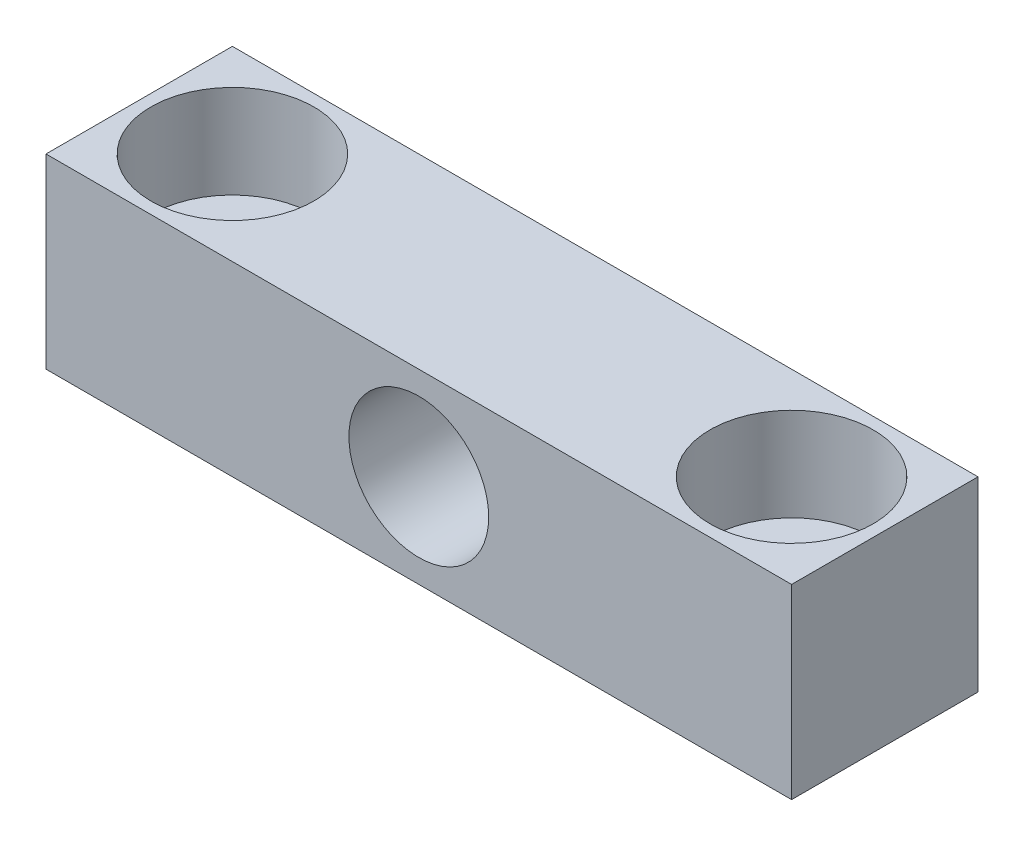
ISO-10303-21;
HEADER;
FILE_DESCRIPTION(('STEP AP214'),'2;1');
FILE_NAME('part.step','',(''),(''),'','','');
FILE_SCHEMA(('AUTOMOTIVE_DESIGN { 1 0 10303 214 1 1 1 1 }'));
ENDSEC;
DATA;
#1=APPLICATION_CONTEXT('core data for automotive mechanical design processes');
#2=APPLICATION_PROTOCOL_DEFINITION('international standard','automotive_design',2000,#1);
#3=PRODUCT_CONTEXT('',#1,'mechanical');
#4=PRODUCT('Part','Part','',(#3));
#5=PRODUCT_RELATED_PRODUCT_CATEGORY('part','',(#4));
#6=PRODUCT_DEFINITION_FORMATION('','',#4);
#7=PRODUCT_DEFINITION_CONTEXT('part definition',#1,'design');
#8=PRODUCT_DEFINITION('design','',#6,#7);
#9=PRODUCT_DEFINITION_SHAPE('','',#8);
#10=(LENGTH_UNIT() NAMED_UNIT(*) SI_UNIT(.MILLI.,.METRE.));
#11=(NAMED_UNIT(*) PLANE_ANGLE_UNIT() SI_UNIT($,.RADIAN.));
#12=(NAMED_UNIT(*) SI_UNIT($,.STERADIAN.) SOLID_ANGLE_UNIT());
#13=UNCERTAINTY_MEASURE_WITH_UNIT(LENGTH_MEASURE(1.E-05),#10,'distance_accuracy_value','');
#14=(GEOMETRIC_REPRESENTATION_CONTEXT(3) GLOBAL_UNCERTAINTY_ASSIGNED_CONTEXT((#13)) GLOBAL_UNIT_ASSIGNED_CONTEXT((#10,
#11,#12)) REPRESENTATION_CONTEXT('',''));
#15=CARTESIAN_POINT('',(0.,0.,0.));
#16=DIRECTION('',(0.,0.,1.));
#17=DIRECTION('',(1.,0.,0.));
#18=AXIS2_PLACEMENT_3D('',#15,#16,#17);
#19=CARTESIAN_POINT('',(-25.4,12.7,-6.35));
#20=DIRECTION('',(1.,0.,0.));
#21=DIRECTION('',(0.,0.,-1.));
#22=AXIS2_PLACEMENT_3D('',#19,#20,#21);
#23=PLANE('',#22);
#24=DIRECTION('',(0.,0.,1.));
#25=VECTOR('',#24,1.);
#26=CARTESIAN_POINT('',(-25.4,0.,-6.35));
#27=LINE('',#26,#25);
#28=CARTESIAN_POINT('',(-25.4,0.,-6.35));
#29=VERTEX_POINT('',#28);
#30=CARTESIAN_POINT('',(-25.4,0.,6.35));
#31=VERTEX_POINT('',#30);
#32=EDGE_CURVE('E95',#29,#31,#27,.T.);
#33=ORIENTED_EDGE('',*,*,#32,.T.);
#34=DIRECTION('',(0.,-1.,0.));
#35=VECTOR('',#34,1.);
#36=CARTESIAN_POINT('',(-25.4,12.7,6.35));
#37=LINE('',#36,#35);
#38=CARTESIAN_POINT('',(-25.4,12.7,6.35));
#39=VERTEX_POINT('',#38);
#40=EDGE_CURVE('E11',#39,#31,#37,.T.);
#41=ORIENTED_EDGE('',*,*,#40,.F.);
#42=DIRECTION('',(0.,0.,1.));
#43=VECTOR('',#42,1.);
#44=CARTESIAN_POINT('',(-25.4,12.7,-6.35));
#45=LINE('',#44,#43);
#46=CARTESIAN_POINT('',(-25.4,12.7,-6.35));
#47=VERTEX_POINT('',#46);
#48=EDGE_CURVE('E83',#47,#39,#45,.T.);
#49=ORIENTED_EDGE('',*,*,#48,.F.);
#50=DIRECTION('',(0.,-1.,0.));
#51=VECTOR('',#50,1.);
#52=CARTESIAN_POINT('',(-25.4,12.7,-6.35));
#53=LINE('',#52,#51);
#54=EDGE_CURVE('E91',#47,#29,#53,.T.);
#55=ORIENTED_EDGE('',*,*,#54,.T.);
#56=EDGE_LOOP('',(#33,#41,#49,#55));
#57=FACE_BOUND('',#56,.T.);
#58=ADVANCED_FACE('F32',(#57),#23,.F.);
#59=CARTESIAN_POINT('',(-25.4,12.7,6.35));
#60=DIRECTION('',(0.,0.,-1.));
#61=DIRECTION('',(-1.,0.,0.));
#62=AXIS2_PLACEMENT_3D('',#59,#60,#61);
#63=PLANE('',#62);
#64=CARTESIAN_POINT('',(0.,6.35,6.35));
#65=DIRECTION('',(0.,0.,1.));
#66=DIRECTION('',(1.,0.,0.));
#67=AXIS2_PLACEMENT_3D('',#64,#65,#66);
#68=CIRCLE('',#67,4.7625);
#69=CARTESIAN_POINT('',(4.7625,6.35,6.35));
#70=VERTEX_POINT('',#69);
#71=EDGE_CURVE('E109',#70,#70,#68,.T.);
#72=ORIENTED_EDGE('',*,*,#71,.F.);
#73=EDGE_LOOP('',(#72));
#74=FACE_BOUND('',#73,.T.);
#75=DIRECTION('',(1.,0.,0.));
#76=VECTOR('',#75,1.);
#77=CARTESIAN_POINT('',(-25.4,0.,6.35));
#78=LINE('',#77,#76);
#79=CARTESIAN_POINT('',(25.4,0.,6.35));
#80=VERTEX_POINT('',#79);
#81=EDGE_CURVE('E87',#31,#80,#78,.T.);
#82=ORIENTED_EDGE('',*,*,#81,.T.);
#83=DIRECTION('',(0.,-1.,0.));
#84=VECTOR('',#83,1.);
#85=CARTESIAN_POINT('',(25.4,12.7,6.35));
#86=LINE('',#85,#84);
#87=CARTESIAN_POINT('',(25.4,12.7,6.35));
#88=VERTEX_POINT('',#87);
#89=EDGE_CURVE('E40',#88,#80,#86,.T.);
#90=ORIENTED_EDGE('',*,*,#89,.F.);
#91=DIRECTION('',(1.,0.,0.));
#92=VECTOR('',#91,1.);
#93=CARTESIAN_POINT('',(-25.4,12.7,6.35));
#94=LINE('',#93,#92);
#95=EDGE_CURVE('E78',#39,#88,#94,.T.);
#96=ORIENTED_EDGE('',*,*,#95,.F.);
#97=ORIENTED_EDGE('',*,*,#40,.T.);
#98=EDGE_LOOP('',(#82,#90,#96,#97));
#99=FACE_BOUND('',#98,.T.);
#100=ADVANCED_FACE('F86',(#74,#99),#63,.F.);
#101=CARTESIAN_POINT('',(25.4,12.7,-6.35));
#102=DIRECTION('',(-1.,0.,0.));
#103=DIRECTION('',(0.,0.,1.));
#104=AXIS2_PLACEMENT_3D('',#101,#102,#103);
#105=PLANE('',#104);
#106=DIRECTION('',(0.,0.,-1.));
#107=VECTOR('',#106,1.);
#108=CARTESIAN_POINT('',(25.4,0.,-6.35));
#109=LINE('',#108,#107);
#110=CARTESIAN_POINT('',(25.4,0.,-6.35));
#111=VERTEX_POINT('',#110);
#112=EDGE_CURVE('E65',#80,#111,#109,.T.);
#113=ORIENTED_EDGE('',*,*,#112,.T.);
#114=DIRECTION('',(0.,-1.,0.));
#115=VECTOR('',#114,1.);
#116=CARTESIAN_POINT('',(25.4,12.7,-6.35));
#117=LINE('',#116,#115);
#118=CARTESIAN_POINT('',(25.4,12.7,-6.35));
#119=VERTEX_POINT('',#118);
#120=EDGE_CURVE('E88',#119,#111,#117,.T.);
#121=ORIENTED_EDGE('',*,*,#120,.F.);
#122=DIRECTION('',(0.,0.,-1.));
#123=VECTOR('',#122,1.);
#124=CARTESIAN_POINT('',(25.4,12.7,-6.35));
#125=LINE('',#124,#123);
#126=EDGE_CURVE('E81',#88,#119,#125,.T.);
#127=ORIENTED_EDGE('',*,*,#126,.F.);
#128=ORIENTED_EDGE('',*,*,#89,.T.);
#129=EDGE_LOOP('',(#113,#121,#127,#128));
#130=FACE_BOUND('',#129,.T.);
#131=ADVANCED_FACE('F89',(#130),#105,.F.);
#132=CARTESIAN_POINT('',(-25.4,12.7,-6.35));
#133=DIRECTION('',(0.,0.,1.));
#134=DIRECTION('',(1.,0.,0.));
#135=AXIS2_PLACEMENT_3D('',#132,#133,#134);
#136=PLANE('',#135);
#137=CARTESIAN_POINT('',(0.,6.35,-6.35));
#138=DIRECTION('',(0.,0.,1.));
#139=DIRECTION('',(1.,0.,0.));
#140=AXIS2_PLACEMENT_3D('',#137,#138,#139);
#141=CIRCLE('',#140,4.7625);
#142=CARTESIAN_POINT('',(4.7625,6.35,-6.35));
#143=VERTEX_POINT('',#142);
#144=EDGE_CURVE('E98',#143,#143,#141,.T.);
#145=ORIENTED_EDGE('',*,*,#144,.T.);
#146=EDGE_LOOP('',(#145));
#147=FACE_BOUND('',#146,.T.);
#148=DIRECTION('',(-1.,0.,0.));
#149=VECTOR('',#148,1.);
#150=CARTESIAN_POINT('',(-25.4,0.,-6.35));
#151=LINE('',#150,#149);
#152=EDGE_CURVE('E71',#111,#29,#151,.T.);
#153=ORIENTED_EDGE('',*,*,#152,.T.);
#154=ORIENTED_EDGE('',*,*,#54,.F.);
#155=DIRECTION('',(-1.,0.,0.));
#156=VECTOR('',#155,1.);
#157=CARTESIAN_POINT('',(-25.4,12.7,-6.35));
#158=LINE('',#157,#156);
#159=EDGE_CURVE('E48',#119,#47,#158,.T.);
#160=ORIENTED_EDGE('',*,*,#159,.F.);
#161=ORIENTED_EDGE('',*,*,#120,.T.);
#162=EDGE_LOOP('',(#153,#154,#160,#161));
#163=FACE_BOUND('',#162,.T.);
#164=ADVANCED_FACE('F103',(#147,#163),#136,.F.);
#165=CARTESIAN_POINT('',(-25.4,12.7,6.35));
#166=DIRECTION('',(0.,1.,0.));
#167=DIRECTION('',(0.,0.,1.));
#168=AXIS2_PLACEMENT_3D('',#165,#166,#167);
#169=PLANE('',#168);
#170=CARTESIAN_POINT('',(19.05,12.7,0.));
#171=DIRECTION('',(0.,1.,0.));
#172=DIRECTION('',(0.,0.,1.));
#173=AXIS2_PLACEMENT_3D('',#170,#171,#172);
#174=CIRCLE('',#173,5.55625);
#175=CARTESIAN_POINT('',(19.05,12.7,5.55624999999999));
#176=VERTEX_POINT('',#175);
#177=EDGE_CURVE('E135',#176,#176,#174,.T.);
#178=ORIENTED_EDGE('',*,*,#177,.F.);
#179=EDGE_LOOP('',(#178));
#180=FACE_BOUND('',#179,.T.);
#181=CARTESIAN_POINT('',(-19.05,12.7,0.));
#182=DIRECTION('',(0.,1.,0.));
#183=DIRECTION('',(0.,0.,1.));
#184=AXIS2_PLACEMENT_3D('',#181,#182,#183);
#185=CIRCLE('',#184,5.55625);
#186=CARTESIAN_POINT('',(-19.05,12.7,5.55624999999999));
#187=VERTEX_POINT('',#186);
#188=EDGE_CURVE('E123',#187,#187,#185,.T.);
#189=ORIENTED_EDGE('',*,*,#188,.F.);
#190=EDGE_LOOP('',(#189));
#191=FACE_BOUND('',#190,.T.);
#192=ORIENTED_EDGE('',*,*,#48,.T.);
#193=ORIENTED_EDGE('',*,*,#95,.T.);
#194=ORIENTED_EDGE('',*,*,#126,.T.);
#195=ORIENTED_EDGE('',*,*,#159,.T.);
#196=EDGE_LOOP('',(#192,#193,#194,#195));
#197=FACE_BOUND('',#196,.T.);
#198=ADVANCED_FACE('F79',(#180,#191,#197),#169,.T.);
#199=CARTESIAN_POINT('',(-25.4,0.,6.35));
#200=DIRECTION('',(0.,1.,0.));
#201=DIRECTION('',(0.,0.,1.));
#202=AXIS2_PLACEMENT_3D('',#199,#200,#201);
#203=PLANE('',#202);
#204=CARTESIAN_POINT('',(19.05,0.,0.));
#205=DIRECTION('',(0.,1.,0.));
#206=DIRECTION('',(0.,0.,1.));
#207=AXIS2_PLACEMENT_3D('',#204,#205,#206);
#208=CIRCLE('',#207,3.3782);
#209=CARTESIAN_POINT('',(19.05,0.,3.3782));
#210=VERTEX_POINT('',#209);
#211=EDGE_CURVE('E126',#210,#210,#208,.T.);
#212=ORIENTED_EDGE('',*,*,#211,.T.);
#213=EDGE_LOOP('',(#212));
#214=FACE_BOUND('',#213,.T.);
#215=CARTESIAN_POINT('',(-19.05,0.,0.));
#216=DIRECTION('',(0.,1.,0.));
#217=DIRECTION('',(0.,0.,1.));
#218=AXIS2_PLACEMENT_3D('',#215,#216,#217);
#219=CIRCLE('',#218,3.3782);
#220=CARTESIAN_POINT('',(-19.05,0.,3.3782));
#221=VERTEX_POINT('',#220);
#222=EDGE_CURVE('E112',#221,#221,#219,.T.);
#223=ORIENTED_EDGE('',*,*,#222,.T.);
#224=EDGE_LOOP('',(#223));
#225=FACE_BOUND('',#224,.T.);
#226=ORIENTED_EDGE('',*,*,#32,.F.);
#227=ORIENTED_EDGE('',*,*,#152,.F.);
#228=ORIENTED_EDGE('',*,*,#112,.F.);
#229=ORIENTED_EDGE('',*,*,#81,.F.);
#230=EDGE_LOOP('',(#226,#227,#228,#229));
#231=FACE_BOUND('',#230,.T.);
#232=ADVANCED_FACE('F106',(#214,#225,#231),#203,.F.);
#233=CARTESIAN_POINT('',(0.,6.35,-6.35));
#234=DIRECTION('',(0.,0.,1.));
#235=DIRECTION('',(1.,0.,0.));
#236=AXIS2_PLACEMENT_3D('',#233,#234,#235);
#237=CYLINDRICAL_SURFACE('',#236,4.7625);
#238=ORIENTED_EDGE('',*,*,#144,.F.);
#239=EDGE_LOOP('',(#238));
#240=FACE_BOUND('',#239,.T.);
#241=ORIENTED_EDGE('',*,*,#71,.T.);
#242=EDGE_LOOP('',(#241));
#243=FACE_BOUND('',#242,.T.);
#244=ADVANCED_FACE('F178',(#240,#243),#237,.F.);
#245=CARTESIAN_POINT('',(-19.05,12.7,0.));
#246=DIRECTION('',(0.,1.,0.));
#247=DIRECTION('',(0.,0.,1.));
#248=AXIS2_PLACEMENT_3D('',#245,#246,#247);
#249=CYLINDRICAL_SURFACE('',#248,3.3782);
#250=ORIENTED_EDGE('',*,*,#222,.F.);
#251=EDGE_LOOP('',(#250));
#252=FACE_BOUND('',#251,.T.);
#253=CARTESIAN_POINT('',(-19.05,6.35,0.));
#254=DIRECTION('',(0.,1.,0.));
#255=DIRECTION('',(0.,0.,1.));
#256=AXIS2_PLACEMENT_3D('',#253,#254,#255);
#257=CIRCLE('',#256,3.37820000000001);
#258=CARTESIAN_POINT('',(-19.05,6.35,3.37820000000001));
#259=VERTEX_POINT('',#258);
#260=EDGE_CURVE('E117',#259,#259,#257,.T.);
#261=ORIENTED_EDGE('',*,*,#260,.T.);
#262=EDGE_LOOP('',(#261));
#263=FACE_BOUND('',#262,.T.);
#264=ADVANCED_FACE('F159',(#252,#263),#249,.F.);
#265=CARTESIAN_POINT('',(-15.6718,6.35,0.));
#266=DIRECTION('',(0.,-1.,0.));
#267=DIRECTION('',(0.,0.,-1.));
#268=AXIS2_PLACEMENT_3D('',#265,#266,#267);
#269=PLANE('',#268);
#270=ORIENTED_EDGE('',*,*,#260,.F.);
#271=EDGE_LOOP('',(#270));
#272=FACE_BOUND('',#271,.T.);
#273=CARTESIAN_POINT('',(-19.05,6.35,0.));
#274=DIRECTION('',(0.,1.,0.));
#275=DIRECTION('',(0.,0.,1.));
#276=AXIS2_PLACEMENT_3D('',#273,#274,#275);
#277=CIRCLE('',#276,5.55625);
#278=CARTESIAN_POINT('',(-19.05,6.35,5.55624999999999));
#279=VERTEX_POINT('',#278);
#280=EDGE_CURVE('E120',#279,#279,#277,.T.);
#281=ORIENTED_EDGE('',*,*,#280,.T.);
#282=EDGE_LOOP('',(#281));
#283=FACE_BOUND('',#282,.T.);
#284=ADVANCED_FACE('F149',(#272,#283),#269,.F.);
#285=CARTESIAN_POINT('',(-19.05,12.7,0.));
#286=DIRECTION('',(0.,1.,0.));
#287=DIRECTION('',(0.,0.,1.));
#288=AXIS2_PLACEMENT_3D('',#285,#286,#287);
#289=CYLINDRICAL_SURFACE('',#288,5.55625);
#290=ORIENTED_EDGE('',*,*,#280,.F.);
#291=EDGE_LOOP('',(#290));
#292=FACE_BOUND('',#291,.T.);
#293=ORIENTED_EDGE('',*,*,#188,.T.);
#294=EDGE_LOOP('',(#293));
#295=FACE_BOUND('',#294,.T.);
#296=ADVANCED_FACE('F146',(#292,#295),#289,.F.);
#297=CARTESIAN_POINT('',(19.05,12.7,0.));
#298=DIRECTION('',(0.,1.,0.));
#299=DIRECTION('',(0.,0.,1.));
#300=AXIS2_PLACEMENT_3D('',#297,#298,#299);
#301=CYLINDRICAL_SURFACE('',#300,3.3782);
#302=ORIENTED_EDGE('',*,*,#211,.F.);
#303=EDGE_LOOP('',(#302));
#304=FACE_BOUND('',#303,.T.);
#305=CARTESIAN_POINT('',(19.05,6.35,0.));
#306=DIRECTION('',(0.,1.,0.));
#307=DIRECTION('',(0.,0.,1.));
#308=AXIS2_PLACEMENT_3D('',#305,#306,#307);
#309=CIRCLE('',#308,3.37820000000001);
#310=CARTESIAN_POINT('',(19.05,6.35,3.37820000000001));
#311=VERTEX_POINT('',#310);
#312=EDGE_CURVE('E129',#311,#311,#309,.T.);
#313=ORIENTED_EDGE('',*,*,#312,.T.);
#314=EDGE_LOOP('',(#313));
#315=FACE_BOUND('',#314,.T.);
#316=ADVANCED_FACE('F148',(#304,#315),#301,.F.);
#317=CARTESIAN_POINT('',(22.4282,6.35,0.));
#318=DIRECTION('',(0.,-1.,0.));
#319=DIRECTION('',(0.,0.,-1.));
#320=AXIS2_PLACEMENT_3D('',#317,#318,#319);
#321=PLANE('',#320);
#322=ORIENTED_EDGE('',*,*,#312,.F.);
#323=EDGE_LOOP('',(#322));
#324=FACE_BOUND('',#323,.T.);
#325=CARTESIAN_POINT('',(19.05,6.35,0.));
#326=DIRECTION('',(0.,1.,0.));
#327=DIRECTION('',(0.,0.,1.));
#328=AXIS2_PLACEMENT_3D('',#325,#326,#327);
#329=CIRCLE('',#328,5.55625);
#330=CARTESIAN_POINT('',(19.05,6.35,5.55624999999999));
#331=VERTEX_POINT('',#330);
#332=EDGE_CURVE('E132',#331,#331,#329,.T.);
#333=ORIENTED_EDGE('',*,*,#332,.T.);
#334=EDGE_LOOP('',(#333));
#335=FACE_BOUND('',#334,.T.);
#336=ADVANCED_FACE('F156',(#324,#335),#321,.F.);
#337=CARTESIAN_POINT('',(19.05,12.7,0.));
#338=DIRECTION('',(0.,1.,0.));
#339=DIRECTION('',(0.,0.,1.));
#340=AXIS2_PLACEMENT_3D('',#337,#338,#339);
#341=CYLINDRICAL_SURFACE('',#340,5.55625);
#342=ORIENTED_EDGE('',*,*,#332,.F.);
#343=EDGE_LOOP('',(#342));
#344=FACE_BOUND('',#343,.T.);
#345=ORIENTED_EDGE('',*,*,#177,.T.);
#346=EDGE_LOOP('',(#345));
#347=FACE_BOUND('',#346,.T.);
#348=ADVANCED_FACE('F139',(#344,#347),#341,.F.);
#349=CLOSED_SHELL('',(#58,#100,#131,#164,#198,#232,#244,#264,#284,#296,#316,#336,#348));
#350=MANIFOLD_SOLID_BREP('B2',#349);
#351=ADVANCED_BREP_SHAPE_REPRESENTATION('',(#18,#350),#14);
#352=SHAPE_DEFINITION_REPRESENTATION(#9,#351);
ENDSEC;
END-ISO-10303-21;
